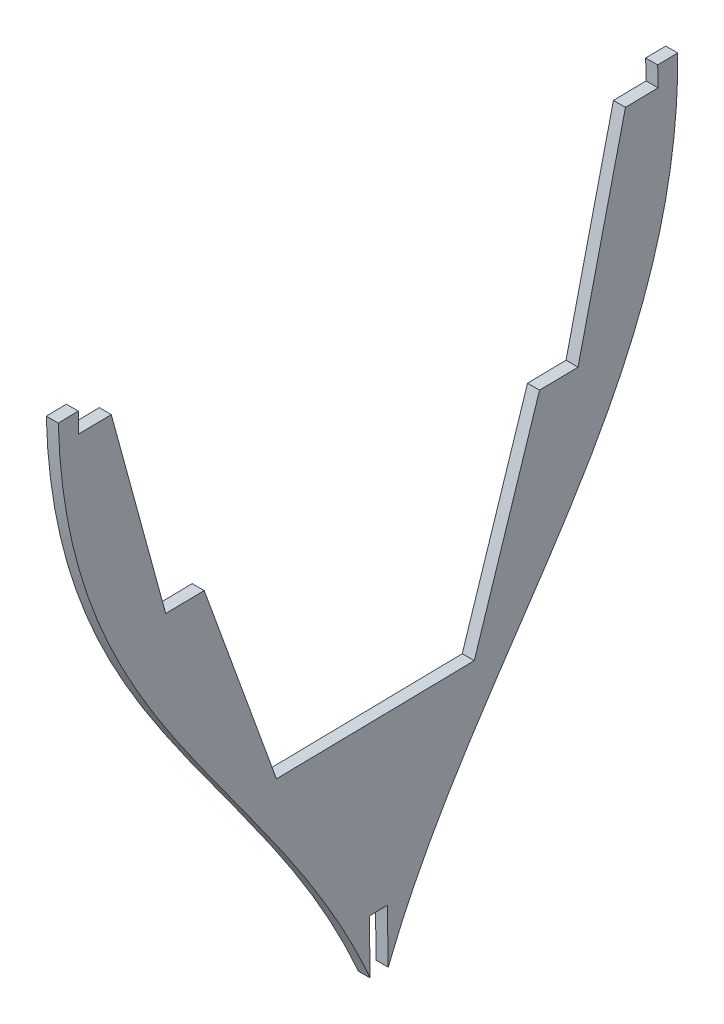
ISO-10303-21;
HEADER;
FILE_DESCRIPTION(('STEP AP214'),'2;1');
FILE_NAME('part.step','',(''),(''),'','','');
FILE_SCHEMA(('AUTOMOTIVE_DESIGN { 1 0 10303 214 1 1 1 1 }'));
ENDSEC;
DATA;
#1=APPLICATION_CONTEXT('core data for automotive mechanical design processes');
#2=APPLICATION_PROTOCOL_DEFINITION('international standard','automotive_design',2000,#1);
#3=PRODUCT_CONTEXT('',#1,'mechanical');
#4=PRODUCT('Part','Part','',(#3));
#5=PRODUCT_RELATED_PRODUCT_CATEGORY('part','',(#4));
#6=PRODUCT_DEFINITION_FORMATION('','',#4);
#7=PRODUCT_DEFINITION_CONTEXT('part definition',#1,'design');
#8=PRODUCT_DEFINITION('design','',#6,#7);
#9=PRODUCT_DEFINITION_SHAPE('','',#8);
#10=(LENGTH_UNIT() NAMED_UNIT(*) SI_UNIT(.MILLI.,.METRE.));
#11=(NAMED_UNIT(*) PLANE_ANGLE_UNIT() SI_UNIT($,.RADIAN.));
#12=(NAMED_UNIT(*) SI_UNIT($,.STERADIAN.) SOLID_ANGLE_UNIT());
#13=UNCERTAINTY_MEASURE_WITH_UNIT(LENGTH_MEASURE(1.E-05),#10,'distance_accuracy_value','');
#14=(GEOMETRIC_REPRESENTATION_CONTEXT(3) GLOBAL_UNCERTAINTY_ASSIGNED_CONTEXT((#13)) GLOBAL_UNIT_ASSIGNED_CONTEXT((#10,
#11,#12)) REPRESENTATION_CONTEXT('',''));
#15=CARTESIAN_POINT('',(0.,0.,0.));
#16=DIRECTION('',(0.,0.,1.));
#17=DIRECTION('',(1.,0.,0.));
#18=AXIS2_PLACEMENT_3D('',#15,#16,#17);
#19=CARTESIAN_POINT('',(6.,27.8968477923104,0.487215218235038));
#20=CARTESIAN_POINT('',(6.,151.528747598314,-43.0475698801011));
#21=CARTESIAN_POINT('',(6.,215.653732265127,-149.467757199494));
#22=CARTESIAN_POINT('',(6.,362.223341232235,-148.243380773087));
#23=B_SPLINE_CURVE_WITH_KNOTS('',3,(#19,#20,#21,#22),.UNSPECIFIED.,.F.,.F.,(4,4),(0.,1.),.UNSPECIFIED.);
#24=DIRECTION('',(-1.,0.,0.));
#25=VECTOR('',#24,1.);
#26=SURFACE_OF_LINEAR_EXTRUSION('',#23,#25);
#27=CARTESIAN_POINT('',(6.,39.416480969907,-3.8122819690517));
#28=VERTEX_POINT('',#27);
#29=CARTESIAN_POINT('',(6.,362.223341232235,-148.243380773087));
#30=VERTEX_POINT('',#29);
#31=EDGE_CURVE('E116',#28,#30,#23,.T.);
#32=ORIENTED_EDGE('',*,*,#31,.F.);
#33=DIRECTION('',(1.,0.,0.));
#34=VECTOR('',#33,1.);
#35=CARTESIAN_POINT('',(0.,39.416480969907,-3.8122819690517));
#36=LINE('',#35,#34);
#37=CARTESIAN_POINT('',(0.,39.416480969907,-3.8122819690517));
#38=VERTEX_POINT('',#37);
#39=EDGE_CURVE('E377',#38,#28,#36,.T.);
#40=ORIENTED_EDGE('',*,*,#39,.F.);
#41=CARTESIAN_POINT('',(0.,27.8968477923104,0.487215218235038));
#42=CARTESIAN_POINT('',(0.,151.528747598314,-43.0475698801011));
#43=CARTESIAN_POINT('',(0.,215.653732265127,-149.467757199494));
#44=CARTESIAN_POINT('',(0.,362.223341232235,-148.243380773087));
#45=B_SPLINE_CURVE_WITH_KNOTS('',3,(#41,#42,#43,#44),.UNSPECIFIED.,.F.,.F.,(4,4),(0.,1.),.UNSPECIFIED.);
#46=CARTESIAN_POINT('',(0.,362.223341232235,-148.243380773087));
#47=VERTEX_POINT('',#46);
#48=EDGE_CURVE('E185',#38,#47,#45,.T.);
#49=ORIENTED_EDGE('',*,*,#48,.T.);
#50=DIRECTION('',(-1.,0.,0.));
#51=VECTOR('',#50,1.);
#52=CARTESIAN_POINT('',(6.,362.223341232235,-148.243380773087));
#53=LINE('',#52,#51);
#54=EDGE_CURVE('E11',#30,#47,#53,.T.);
#55=ORIENTED_EDGE('',*,*,#54,.F.);
#56=EDGE_LOOP('',(#32,#40,#49,#55));
#57=FACE_BOUND('',#56,.T.);
#58=ADVANCED_FACE('F33',(#57),#26,.F.);
#59=CARTESIAN_POINT('',(6.,362.223341232235,-148.243380773087));
#60=DIRECTION('',(0.,-0.999847523789273,-0.0174622212922194));
#61=DIRECTION('',(0.,0.0174622212922194,-0.999847523789274));
#62=AXIS2_PLACEMENT_3D('',#59,#60,#61);
#63=PLANE('',#62);
#64=DIRECTION('',(0.,-0.0174622212922194,0.999847523789273));
#65=VECTOR('',#64,1.);
#66=CARTESIAN_POINT('',(0.,362.223341232235,-148.243380773087));
#67=LINE('',#66,#65);
#68=CARTESIAN_POINT('',(0.,362.048719019313,-138.244905535194));
#69=VERTEX_POINT('',#68);
#70=EDGE_CURVE('E251',#47,#69,#67,.T.);
#71=ORIENTED_EDGE('',*,*,#70,.T.);
#72=DIRECTION('',(-1.,0.,0.));
#73=VECTOR('',#72,1.);
#74=CARTESIAN_POINT('',(6.,362.048719019313,-138.244905535194));
#75=LINE('',#74,#73);
#76=CARTESIAN_POINT('',(6.,362.048719019313,-138.244905535194));
#77=VERTEX_POINT('',#76);
#78=EDGE_CURVE('E41',#77,#69,#75,.T.);
#79=ORIENTED_EDGE('',*,*,#78,.F.);
#80=DIRECTION('',(0.,-0.0174622212922194,0.999847523789273));
#81=VECTOR('',#80,1.);
#82=CARTESIAN_POINT('',(6.,362.223341232235,-148.243380773087));
#83=LINE('',#82,#81);
#84=EDGE_CURVE('E327',#30,#77,#83,.T.);
#85=ORIENTED_EDGE('',*,*,#84,.F.);
#86=ORIENTED_EDGE('',*,*,#54,.T.);
#87=EDGE_LOOP('',(#71,#79,#85,#86));
#88=FACE_BOUND('',#87,.T.);
#89=ADVANCED_FACE('F241',(#88),#63,.F.);
#90=CARTESIAN_POINT('',(6.,362.048719019313,-138.244905535194));
#91=DIRECTION('',(0.,0.0174622212922165,-0.999847523789273));
#92=DIRECTION('',(0.,0.999847523789274,0.0174622212922165));
#93=AXIS2_PLACEMENT_3D('',#90,#91,#92);
#94=PLANE('',#93);
#95=DIRECTION('',(0.,-0.999847523789274,-0.0174622212922165));
#96=VECTOR('',#95,1.);
#97=CARTESIAN_POINT('',(0.,362.048719019313,-138.244905535194));
#98=LINE('',#97,#96);
#99=CARTESIAN_POINT('',(0.,352.05024378142,-138.419527748117));
#100=VERTEX_POINT('',#99);
#101=EDGE_CURVE('E258',#69,#100,#98,.T.);
#102=ORIENTED_EDGE('',*,*,#101,.T.);
#103=DIRECTION('',(-1.,0.,0.));
#104=VECTOR('',#103,1.);
#105=CARTESIAN_POINT('',(6.,352.05024378142,-138.419527748117));
#106=LINE('',#105,#104);
#107=CARTESIAN_POINT('',(6.,352.05024378142,-138.419527748117));
#108=VERTEX_POINT('',#107);
#109=EDGE_CURVE('E262',#108,#100,#106,.T.);
#110=ORIENTED_EDGE('',*,*,#109,.F.);
#111=DIRECTION('',(0.,-0.999847523789274,-0.0174622212922165));
#112=VECTOR('',#111,1.);
#113=CARTESIAN_POINT('',(6.,362.048719019313,-138.244905535194));
#114=LINE('',#113,#112);
#115=EDGE_CURVE('E261',#77,#108,#114,.T.);
#116=ORIENTED_EDGE('',*,*,#115,.F.);
#117=ORIENTED_EDGE('',*,*,#78,.T.);
#118=EDGE_LOOP('',(#102,#110,#116,#117));
#119=FACE_BOUND('',#118,.T.);
#120=ADVANCED_FACE('F238',(#119),#94,.F.);
#121=CARTESIAN_POINT('',(6.,352.05024378142,-138.419527748117));
#122=DIRECTION('',(0.,-0.999847523789273,-0.0174622212922217));
#123=DIRECTION('',(0.,0.0174622212922217,-0.999847523789273));
#124=AXIS2_PLACEMENT_3D('',#121,#122,#123);
#125=PLANE('',#124);
#126=DIRECTION('',(0.,-0.0174622212922217,0.999847523789273));
#127=VECTOR('',#126,1.);
#128=CARTESIAN_POINT('',(0.,352.05024378142,-138.419527748117));
#129=LINE('',#128,#127);
#130=CARTESIAN_POINT('',(0.,351.766257074299,-122.159087500981));
#131=VERTEX_POINT('',#130);
#132=EDGE_CURVE('E265',#100,#131,#129,.T.);
#133=ORIENTED_EDGE('',*,*,#132,.T.);
#134=DIRECTION('',(-1.,0.,0.));
#135=VECTOR('',#134,1.);
#136=CARTESIAN_POINT('',(6.,351.766257074299,-122.159087500981));
#137=LINE('',#136,#135);
#138=CARTESIAN_POINT('',(6.,351.766257074299,-122.159087500981));
#139=VERTEX_POINT('',#138);
#140=EDGE_CURVE('E316',#139,#131,#137,.T.);
#141=ORIENTED_EDGE('',*,*,#140,.F.);
#142=DIRECTION('',(0.,-0.0174622212922217,0.999847523789273));
#143=VECTOR('',#142,1.);
#144=CARTESIAN_POINT('',(6.,352.05024378142,-138.419527748117));
#145=LINE('',#144,#143);
#146=EDGE_CURVE('E321',#108,#139,#145,.T.);
#147=ORIENTED_EDGE('',*,*,#146,.F.);
#148=ORIENTED_EDGE('',*,*,#109,.T.);
#149=EDGE_LOOP('',(#133,#141,#147,#148));
#150=FACE_BOUND('',#149,.T.);
#151=ADVANCED_FACE('F234',(#150),#125,.F.);
#152=CARTESIAN_POINT('',(6.,351.766257074299,-122.159087500981));
#153=DIRECTION('',(0.,-0.229351512790053,-0.973343661602064));
#154=DIRECTION('',(0.,0.973343661602065,-0.229351512790053));
#155=AXIS2_PLACEMENT_3D('',#152,#153,#154);
#156=PLANE('',#155);
#157=DIRECTION('',(0.,-0.973343661602065,0.229351512790053));
#158=VECTOR('',#157,1.);
#159=CARTESIAN_POINT('',(0.,351.766257074299,-122.159087500981));
#160=LINE('',#159,#158);
#161=CARTESIAN_POINT('',(0.,251.337713909767,-98.4948472015425));
#162=VERTEX_POINT('',#161);
#163=EDGE_CURVE('E267',#131,#162,#160,.T.);
#164=ORIENTED_EDGE('',*,*,#163,.T.);
#165=DIRECTION('',(-1.,0.,0.));
#166=VECTOR('',#165,1.);
#167=CARTESIAN_POINT('',(6.,251.337713909767,-98.4948472015425));
#168=LINE('',#167,#166);
#169=CARTESIAN_POINT('',(6.,251.337713909767,-98.4948472015425));
#170=VERTEX_POINT('',#169);
#171=EDGE_CURVE('E313',#170,#162,#168,.T.);
#172=ORIENTED_EDGE('',*,*,#171,.F.);
#173=DIRECTION('',(0.,-0.973343661602065,0.229351512790053));
#174=VECTOR('',#173,1.);
#175=CARTESIAN_POINT('',(6.,351.766257074299,-122.159087500981));
#176=LINE('',#175,#174);
#177=EDGE_CURVE('E323',#139,#170,#176,.T.);
#178=ORIENTED_EDGE('',*,*,#177,.F.);
#179=ORIENTED_EDGE('',*,*,#140,.T.);
#180=EDGE_LOOP('',(#164,#172,#178,#179));
#181=FACE_BOUND('',#180,.T.);
#182=ADVANCED_FACE('F230',(#181),#156,.F.);
#183=CARTESIAN_POINT('',(6.,251.337713909767,-98.4948472015425));
#184=DIRECTION('',(0.,-0.999847523789273,-0.0174622212922211));
#185=DIRECTION('',(0.,0.0174622212922211,-0.999847523789273));
#186=AXIS2_PLACEMENT_3D('',#183,#184,#185);
#187=PLANE('',#186);
#188=DIRECTION('',(0.,-0.0174622212922211,0.999847523789273));
#189=VECTOR('',#188,1.);
#190=CARTESIAN_POINT('',(0.,251.337713909767,-98.4948472015425));
#191=LINE('',#190,#189);
#192=CARTESIAN_POINT('',(0.,251.002379323885,-79.2943428828873));
#193=VERTEX_POINT('',#192);
#194=EDGE_CURVE('E271',#162,#193,#191,.T.);
#195=ORIENTED_EDGE('',*,*,#194,.T.);
#196=DIRECTION('',(-1.,0.,0.));
#197=VECTOR('',#196,1.);
#198=CARTESIAN_POINT('',(6.,251.002379323885,-79.2943428828873));
#199=LINE('',#198,#197);
#200=CARTESIAN_POINT('',(6.,251.002379323885,-79.2943428828873));
#201=VERTEX_POINT('',#200);
#202=EDGE_CURVE('E310',#201,#193,#199,.T.);
#203=ORIENTED_EDGE('',*,*,#202,.F.);
#204=DIRECTION('',(0.,-0.0174622212922211,0.999847523789273));
#205=VECTOR('',#204,1.);
#206=CARTESIAN_POINT('',(6.,251.337713909767,-98.4948472015425));
#207=LINE('',#206,#205);
#208=EDGE_CURVE('E325',#170,#201,#207,.T.);
#209=ORIENTED_EDGE('',*,*,#208,.F.);
#210=ORIENTED_EDGE('',*,*,#171,.T.);
#211=EDGE_LOOP('',(#195,#203,#209,#210));
#212=FACE_BOUND('',#211,.T.);
#213=ADVANCED_FACE('F226',(#212),#187,.F.);
#214=CARTESIAN_POINT('',(6.,251.002379323885,-79.2943428828873));
#215=DIRECTION('',(0.,-0.308006886330143,-0.951384127454947));
#216=DIRECTION('',(0.,0.951384127454947,-0.308006886330143));
#217=AXIS2_PLACEMENT_3D('',#214,#215,#216);
#218=PLANE('',#217);
#219=DIRECTION('',(0.,-0.951384127454947,0.308006886330143));
#220=VECTOR('',#219,1.);
#221=CARTESIAN_POINT('',(0.,251.002379323885,-79.2943428828873));
#222=LINE('',#221,#220);
#223=CARTESIAN_POINT('',(0.,150.41840870766,-46.730676210097));
#224=VERTEX_POINT('',#223);
#225=EDGE_CURVE('E273',#193,#224,#222,.T.);
#226=ORIENTED_EDGE('',*,*,#225,.T.);
#227=DIRECTION('',(-1.,0.,0.));
#228=VECTOR('',#227,1.);
#229=CARTESIAN_POINT('',(6.,150.41840870766,-46.730676210097));
#230=LINE('',#229,#228);
#231=CARTESIAN_POINT('',(6.,150.41840870766,-46.730676210097));
#232=VERTEX_POINT('',#231);
#233=EDGE_CURVE('E307',#232,#224,#230,.T.);
#234=ORIENTED_EDGE('',*,*,#233,.F.);
#235=DIRECTION('',(0.,-0.951384127454947,0.308006886330143));
#236=VECTOR('',#235,1.);
#237=CARTESIAN_POINT('',(6.,251.002379323885,-79.2943428828873));
#238=LINE('',#237,#236);
#239=EDGE_CURVE('E332',#201,#232,#238,.T.);
#240=ORIENTED_EDGE('',*,*,#239,.F.);
#241=ORIENTED_EDGE('',*,*,#202,.T.);
#242=EDGE_LOOP('',(#226,#234,#240,#241));
#243=FACE_BOUND('',#242,.T.);
#244=ADVANCED_FACE('F222',(#243),#218,.F.);
#245=CARTESIAN_POINT('',(6.,150.41840870766,-46.730676210097));
#246=DIRECTION('',(0.,-0.999847523789273,-0.017462221292222));
#247=DIRECTION('',(0.,0.017462221292222,-0.999847523789273));
#248=AXIS2_PLACEMENT_3D('',#245,#246,#247);
#249=PLANE('',#248);
#250=DIRECTION('',(0.,-0.017462221292222,0.999847523789273));
#251=VECTOR('',#250,1.);
#252=CARTESIAN_POINT('',(0.,150.41840870766,-46.730676210097));
#253=LINE('',#252,#251);
#254=CARTESIAN_POINT('',(0.,148.694880815353,51.9546551957129));
#255=VERTEX_POINT('',#254);
#256=EDGE_CURVE('E275',#224,#255,#253,.T.);
#257=ORIENTED_EDGE('',*,*,#256,.T.);
#258=DIRECTION('',(-1.,0.,0.));
#259=VECTOR('',#258,1.);
#260=CARTESIAN_POINT('',(6.,148.694880815353,51.9546551957129));
#261=LINE('',#260,#259);
#262=CARTESIAN_POINT('',(6.,148.694880815353,51.9546551957129));
#263=VERTEX_POINT('',#262);
#264=EDGE_CURVE('E304',#263,#255,#261,.T.);
#265=ORIENTED_EDGE('',*,*,#264,.F.);
#266=DIRECTION('',(0.,-0.017462221292222,0.999847523789273));
#267=VECTOR('',#266,1.);
#268=CARTESIAN_POINT('',(6.,150.41840870766,-46.730676210097));
#269=LINE('',#268,#267);
#270=EDGE_CURVE('E334',#232,#263,#269,.T.);
#271=ORIENTED_EDGE('',*,*,#270,.F.);
#272=ORIENTED_EDGE('',*,*,#233,.T.);
#273=EDGE_LOOP('',(#257,#265,#271,#272));
#274=FACE_BOUND('',#273,.T.);
#275=ADVANCED_FACE('F218',(#274),#249,.F.);
#276=CARTESIAN_POINT('',(6.,248.080414956982,88.0107661269475));
#277=DIRECTION('',(0.,-0.341040539835259,0.940048589270191));
#278=DIRECTION('',(0.,-0.940048589270191,-0.341040539835259));
#279=AXIS2_PLACEMENT_3D('',#276,#277,#278);
#280=PLANE('',#279);
#281=DIRECTION('',(0.,0.940048589270191,0.341040539835259));
#282=VECTOR('',#281,1.);
#283=CARTESIAN_POINT('',(0.,248.080414956982,88.0107661269475));
#284=LINE('',#283,#282);
#285=CARTESIAN_POINT('',(0.,248.080414956982,88.0107661269475));
#286=VERTEX_POINT('',#285);
#287=EDGE_CURVE('E277',#255,#286,#284,.T.);
#288=ORIENTED_EDGE('',*,*,#287,.T.);
#289=DIRECTION('',(-1.,0.,0.));
#290=VECTOR('',#289,1.);
#291=CARTESIAN_POINT('',(6.,248.080414956982,88.0107661269475));
#292=LINE('',#291,#290);
#293=CARTESIAN_POINT('',(6.,248.080414956982,88.0107661269475));
#294=VERTEX_POINT('',#293);
#295=EDGE_CURVE('E301',#294,#286,#292,.T.);
#296=ORIENTED_EDGE('',*,*,#295,.F.);
#297=DIRECTION('',(0.,0.940048589270191,0.341040539835259));
#298=VECTOR('',#297,1.);
#299=CARTESIAN_POINT('',(6.,248.080414956982,88.0107661269475));
#300=LINE('',#299,#298);
#301=EDGE_CURVE('E336',#263,#294,#300,.T.);
#302=ORIENTED_EDGE('',*,*,#301,.F.);
#303=ORIENTED_EDGE('',*,*,#264,.T.);
#304=EDGE_LOOP('',(#288,#296,#302,#303));
#305=FACE_BOUND('',#304,.T.);
#306=ADVANCED_FACE('F214',(#305),#280,.F.);
#307=CARTESIAN_POINT('',(6.,247.7450803711,107.211270445603));
#308=DIRECTION('',(0.,-0.999847523789273,-0.0174622212922211));
#309=DIRECTION('',(0.,0.0174622212922211,-0.999847523789273));
#310=AXIS2_PLACEMENT_3D('',#307,#308,#309);
#311=PLANE('',#310);
#312=DIRECTION('',(0.,-0.0174622212922211,0.999847523789273));
#313=VECTOR('',#312,1.);
#314=CARTESIAN_POINT('',(0.,247.7450803711,107.211270445603));
#315=LINE('',#314,#313);
#316=CARTESIAN_POINT('',(0.,247.7450803711,107.211270445603));
#317=VERTEX_POINT('',#316);
#318=EDGE_CURVE('E279',#286,#317,#315,.T.);
#319=ORIENTED_EDGE('',*,*,#318,.T.);
#320=DIRECTION('',(-1.,0.,0.));
#321=VECTOR('',#320,1.);
#322=CARTESIAN_POINT('',(6.,247.7450803711,107.211270445603));
#323=LINE('',#322,#321);
#324=CARTESIAN_POINT('',(6.,247.7450803711,107.211270445603));
#325=VERTEX_POINT('',#324);
#326=EDGE_CURVE('E298',#325,#317,#323,.T.);
#327=ORIENTED_EDGE('',*,*,#326,.F.);
#328=DIRECTION('',(0.,-0.0174622212922211,0.999847523789273));
#329=VECTOR('',#328,1.);
#330=CARTESIAN_POINT('',(6.,247.7450803711,107.211270445603));
#331=LINE('',#330,#329);
#332=EDGE_CURVE('E338',#294,#325,#331,.T.);
#333=ORIENTED_EDGE('',*,*,#332,.F.);
#334=ORIENTED_EDGE('',*,*,#295,.T.);
#335=EDGE_LOOP('',(#319,#327,#333,#334));
#336=FACE_BOUND('',#335,.T.);
#337=ADVANCED_FACE('F210',(#336),#311,.F.);
#338=CARTESIAN_POINT('',(6.,347.286041964423,134.367955003485));
#339=DIRECTION('',(0.,-0.263199942482856,0.964741307437917));
#340=DIRECTION('',(0.,-0.964741307437917,-0.263199942482856));
#341=AXIS2_PLACEMENT_3D('',#338,#339,#340);
#342=PLANE('',#341);
#343=DIRECTION('',(0.,0.964741307437917,0.263199942482856));
#344=VECTOR('',#343,1.);
#345=CARTESIAN_POINT('',(0.,347.286041964423,134.367955003485));
#346=LINE('',#345,#344);
#347=CARTESIAN_POINT('',(0.,347.286041964423,134.367955003485));
#348=VERTEX_POINT('',#347);
#349=EDGE_CURVE('E281',#317,#348,#346,.T.);
#350=ORIENTED_EDGE('',*,*,#349,.T.);
#351=DIRECTION('',(-1.,0.,0.));
#352=VECTOR('',#351,1.);
#353=CARTESIAN_POINT('',(6.,347.286041964423,134.367955003485));
#354=LINE('',#353,#352);
#355=CARTESIAN_POINT('',(6.,347.286041964423,134.367955003485));
#356=VERTEX_POINT('',#355);
#357=EDGE_CURVE('E171',#356,#348,#354,.T.);
#358=ORIENTED_EDGE('',*,*,#357,.F.);
#359=DIRECTION('',(0.,0.964741307437917,0.263199942482856));
#360=VECTOR('',#359,1.);
#361=CARTESIAN_POINT('',(6.,347.286041964423,134.367955003485));
#362=LINE('',#361,#360);
#363=EDGE_CURVE('E159',#325,#356,#362,.T.);
#364=ORIENTED_EDGE('',*,*,#363,.F.);
#365=ORIENTED_EDGE('',*,*,#326,.T.);
#366=EDGE_LOOP('',(#350,#358,#364,#365));
#367=FACE_BOUND('',#366,.T.);
#368=ADVANCED_FACE('F207',(#367),#342,.F.);
#369=CARTESIAN_POINT('',(6.,347.002055257302,150.628395250621));
#370=DIRECTION('',(0.,-0.999847523789273,-0.0174622212922217));
#371=DIRECTION('',(0.,0.0174622212922217,-0.999847523789273));
#372=AXIS2_PLACEMENT_3D('',#369,#370,#371);
#373=PLANE('',#372);
#374=DIRECTION('',(0.,-0.0174622212922217,0.999847523789273));
#375=VECTOR('',#374,1.);
#376=CARTESIAN_POINT('',(0.,347.002055257302,150.628395250621));
#377=LINE('',#376,#375);
#378=CARTESIAN_POINT('',(0.,347.002055257302,150.628395250621));
#379=VERTEX_POINT('',#378);
#380=EDGE_CURVE('E168',#348,#379,#377,.T.);
#381=ORIENTED_EDGE('',*,*,#380,.T.);
#382=DIRECTION('',(-1.,0.,0.));
#383=VECTOR('',#382,1.);
#384=CARTESIAN_POINT('',(6.,347.002055257302,150.628395250621));
#385=LINE('',#384,#383);
#386=CARTESIAN_POINT('',(6.,347.002055257302,150.628395250621));
#387=VERTEX_POINT('',#386);
#388=EDGE_CURVE('E165',#387,#379,#385,.T.);
#389=ORIENTED_EDGE('',*,*,#388,.F.);
#390=DIRECTION('',(0.,-0.0174622212922217,0.999847523789273));
#391=VECTOR('',#390,1.);
#392=CARTESIAN_POINT('',(6.,347.002055257302,150.628395250621));
#393=LINE('',#392,#391);
#394=EDGE_CURVE('E151',#356,#387,#393,.T.);
#395=ORIENTED_EDGE('',*,*,#394,.F.);
#396=ORIENTED_EDGE('',*,*,#357,.T.);
#397=EDGE_LOOP('',(#381,#389,#395,#396));
#398=FACE_BOUND('',#397,.T.);
#399=ADVANCED_FACE('F166',(#398),#373,.F.);
#400=CARTESIAN_POINT('',(6.,357.000530495195,150.803017463543));
#401=DIRECTION('',(0.,-0.017462221292222,0.999847523789273));
#402=DIRECTION('',(0.,-0.999847523789273,-0.017462221292222));
#403=AXIS2_PLACEMENT_3D('',#400,#401,#402);
#404=PLANE('',#403);
#405=DIRECTION('',(0.,0.999847523789273,0.017462221292222));
#406=VECTOR('',#405,1.);
#407=CARTESIAN_POINT('',(0.,357.000530495195,150.803017463543));
#408=LINE('',#407,#406);
#409=CARTESIAN_POINT('',(0.,357.000530495195,150.803017463543));
#410=VERTEX_POINT('',#409);
#411=EDGE_CURVE('E284',#379,#410,#408,.T.);
#412=ORIENTED_EDGE('',*,*,#411,.T.);
#413=DIRECTION('',(-1.,0.,0.));
#414=VECTOR('',#413,1.);
#415=CARTESIAN_POINT('',(6.,357.000530495195,150.803017463543));
#416=LINE('',#415,#414);
#417=CARTESIAN_POINT('',(6.,357.000530495195,150.803017463543));
#418=VERTEX_POINT('',#417);
#419=EDGE_CURVE('E172',#418,#410,#416,.T.);
#420=ORIENTED_EDGE('',*,*,#419,.F.);
#421=DIRECTION('',(0.,0.999847523789273,0.017462221292222));
#422=VECTOR('',#421,1.);
#423=CARTESIAN_POINT('',(6.,357.000530495195,150.803017463543));
#424=LINE('',#423,#422);
#425=EDGE_CURVE('E156',#387,#418,#424,.T.);
#426=ORIENTED_EDGE('',*,*,#425,.F.);
#427=ORIENTED_EDGE('',*,*,#388,.T.);
#428=EDGE_LOOP('',(#412,#420,#426,#427));
#429=FACE_BOUND('',#428,.T.);
#430=ADVANCED_FACE('F174',(#429),#404,.F.);
#431=CARTESIAN_POINT('',(6.,356.825908282272,160.801492701436));
#432=DIRECTION('',(0.,-0.999847523789273,-0.0174622212922193));
#433=DIRECTION('',(0.,0.0174622212922193,-0.999847523789274));
#434=AXIS2_PLACEMENT_3D('',#431,#432,#433);
#435=PLANE('',#434);
#436=DIRECTION('',(0.,-0.0174622212922193,0.999847523789273));
#437=VECTOR('',#436,1.);
#438=CARTESIAN_POINT('',(0.,356.825908282272,160.801492701436));
#439=LINE('',#438,#437);
#440=CARTESIAN_POINT('',(0.,356.825908282272,160.801492701436));
#441=VERTEX_POINT('',#440);
#442=EDGE_CURVE('E108',#410,#441,#439,.T.);
#443=ORIENTED_EDGE('',*,*,#442,.T.);
#444=DIRECTION('',(-1.,0.,0.));
#445=VECTOR('',#444,1.);
#446=CARTESIAN_POINT('',(6.,356.825908282272,160.801492701436));
#447=LINE('',#446,#445);
#448=CARTESIAN_POINT('',(6.,356.825908282272,160.801492701436));
#449=VERTEX_POINT('',#448);
#450=EDGE_CURVE('E184',#449,#441,#447,.T.);
#451=ORIENTED_EDGE('',*,*,#450,.F.);
#452=DIRECTION('',(0.,-0.0174622212922193,0.999847523789273));
#453=VECTOR('',#452,1.);
#454=CARTESIAN_POINT('',(6.,356.825908282272,160.801492701436));
#455=LINE('',#454,#453);
#456=EDGE_CURVE('E57',#418,#449,#455,.T.);
#457=ORIENTED_EDGE('',*,*,#456,.F.);
#458=ORIENTED_EDGE('',*,*,#419,.T.);
#459=EDGE_LOOP('',(#443,#451,#457,#458));
#460=FACE_BOUND('',#459,.T.);
#461=ADVANCED_FACE('F197',(#460),#435,.F.);
#462=CARTESIAN_POINT('',(6.,356.825908282272,160.801492701436));
#463=CARTESIAN_POINT('',(6.,210.302931870083,156.907041043331));
#464=CARTESIAN_POINT('',(6.,149.933153379042,48.3125670929661));
#465=CARTESIAN_POINT('',(6.,27.8968477923104,0.487215218235038));
#466=B_SPLINE_CURVE_WITH_KNOTS('',3,(#462,#463,#464,#465),.UNSPECIFIED.,.F.,.F.,(4,4),(0.,1.),.UNSPECIFIED.);
#467=DIRECTION('',(-1.,0.,0.));
#468=VECTOR('',#467,1.);
#469=SURFACE_OF_LINEAR_EXTRUSION('',#466,#468);
#470=CARTESIAN_POINT('',(0.,356.825908282272,160.801492701436));
#471=CARTESIAN_POINT('',(0.,210.302931870083,156.907041043331));
#472=CARTESIAN_POINT('',(0.,149.933153379042,48.3125670929661));
#473=CARTESIAN_POINT('',(0.,27.8968477923104,0.487215218235038));
#474=B_SPLINE_CURVE_WITH_KNOTS('',3,(#470,#471,#472,#473),.UNSPECIFIED.,.F.,.F.,(4,4),(0.,1.),.UNSPECIFIED.);
#475=CARTESIAN_POINT('',(0.,39.259320978277,5.18634574505176));
#476=VERTEX_POINT('',#475);
#477=EDGE_CURVE('E287',#441,#476,#474,.T.);
#478=ORIENTED_EDGE('',*,*,#477,.T.);
#479=DIRECTION('',(1.,0.,0.));
#480=VECTOR('',#479,1.);
#481=CARTESIAN_POINT('',(0.,39.259320978277,5.18634574505176));
#482=LINE('',#481,#480);
#483=CARTESIAN_POINT('',(6.,39.259320978277,5.18634574505176));
#484=VERTEX_POINT('',#483);
#485=EDGE_CURVE('E349',#476,#484,#482,.T.);
#486=ORIENTED_EDGE('',*,*,#485,.T.);
#487=EDGE_CURVE('E176',#449,#484,#466,.T.);
#488=ORIENTED_EDGE('',*,*,#487,.F.);
#489=ORIENTED_EDGE('',*,*,#450,.T.);
#490=EDGE_LOOP('',(#478,#486,#488,#489));
#491=FACE_BOUND('',#490,.T.);
#492=ADVANCED_FACE('F193',(#491),#469,.F.);
#493=CARTESIAN_POINT('',(6.,186.458453576859,-90.6627683492046));
#494=DIRECTION('',(1.,0.,0.));
#495=DIRECTION('',(0.,0.,-1.));
#496=AXIS2_PLACEMENT_3D('',#493,#494,#495);
#497=PLANE('',#496);
#498=DIRECTION('',(0.,-0.999847523789273,-0.0174622212922221));
#499=VECTOR('',#498,1.);
#500=CARTESIAN_POINT('',(6.,39.259320978277,5.18634574505176));
#501=LINE('',#500,#499);
#502=CARTESIAN_POINT('',(6.,66.2552041205874,5.65782571994176));
#503=VERTEX_POINT('',#502);
#504=EDGE_CURVE('E353',#503,#484,#501,.T.);
#505=ORIENTED_EDGE('',*,*,#504,.F.);
#506=DIRECTION('',(0.,-0.0174622212922227,0.999847523789273));
#507=VECTOR('',#506,1.);
#508=CARTESIAN_POINT('',(6.,66.2552041205874,5.65782571994176));
#509=LINE('',#508,#507);
#510=CARTESIAN_POINT('',(6.,66.4123641122174,-3.3408019941617));
#511=VERTEX_POINT('',#510);
#512=EDGE_CURVE('E371',#511,#503,#509,.T.);
#513=ORIENTED_EDGE('',*,*,#512,.F.);
#514=DIRECTION('',(0.,0.999847523789273,0.0174622212922223));
#515=VECTOR('',#514,1.);
#516=CARTESIAN_POINT('',(6.,66.4123641122174,-3.3408019941617));
#517=LINE('',#516,#515);
#518=EDGE_CURVE('E384',#28,#511,#517,.T.);
#519=ORIENTED_EDGE('',*,*,#518,.F.);
#520=ORIENTED_EDGE('',*,*,#31,.T.);
#521=ORIENTED_EDGE('',*,*,#84,.T.);
#522=ORIENTED_EDGE('',*,*,#115,.T.);
#523=ORIENTED_EDGE('',*,*,#146,.T.);
#524=ORIENTED_EDGE('',*,*,#177,.T.);
#525=ORIENTED_EDGE('',*,*,#208,.T.);
#526=ORIENTED_EDGE('',*,*,#239,.T.);
#527=ORIENTED_EDGE('',*,*,#270,.T.);
#528=ORIENTED_EDGE('',*,*,#301,.T.);
#529=ORIENTED_EDGE('',*,*,#332,.T.);
#530=ORIENTED_EDGE('',*,*,#363,.T.);
#531=ORIENTED_EDGE('',*,*,#394,.T.);
#532=ORIENTED_EDGE('',*,*,#425,.T.);
#533=ORIENTED_EDGE('',*,*,#456,.T.);
#534=ORIENTED_EDGE('',*,*,#487,.T.);
#535=EDGE_LOOP('',(#505,#513,#519,#520,#521,#522,#523,#524,#525,#526,#527,#528,#529,#530,#531,
#532,#533,#534));
#536=FACE_BOUND('',#535,.T.);
#537=ADVANCED_FACE('F154',(#536),#497,.T.);
#538=CARTESIAN_POINT('',(0.,186.458453576859,-90.6627683492046));
#539=DIRECTION('',(1.,0.,0.));
#540=DIRECTION('',(0.,0.,-1.));
#541=AXIS2_PLACEMENT_3D('',#538,#539,#540);
#542=PLANE('',#541);
#543=DIRECTION('',(0.,-0.0174622212922227,0.999847523789273));
#544=VECTOR('',#543,1.);
#545=CARTESIAN_POINT('',(0.,66.2552041205874,5.65782571994176));
#546=LINE('',#545,#544);
#547=CARTESIAN_POINT('',(0.,66.4123641122174,-3.34080199416171));
#548=VERTEX_POINT('',#547);
#549=CARTESIAN_POINT('',(0.,66.2552041205874,5.65782571994176));
#550=VERTEX_POINT('',#549);
#551=EDGE_CURVE('E48',#548,#550,#546,.T.);
#552=ORIENTED_EDGE('',*,*,#551,.T.);
#553=DIRECTION('',(0.,-0.999847523789273,-0.0174622212922221));
#554=VECTOR('',#553,1.);
#555=CARTESIAN_POINT('',(0.,39.259320978277,5.18634574505176));
#556=LINE('',#555,#554);
#557=EDGE_CURVE('E375',#550,#476,#556,.T.);
#558=ORIENTED_EDGE('',*,*,#557,.T.);
#559=ORIENTED_EDGE('',*,*,#477,.F.);
#560=ORIENTED_EDGE('',*,*,#442,.F.);
#561=ORIENTED_EDGE('',*,*,#411,.F.);
#562=ORIENTED_EDGE('',*,*,#380,.F.);
#563=ORIENTED_EDGE('',*,*,#349,.F.);
#564=ORIENTED_EDGE('',*,*,#318,.F.);
#565=ORIENTED_EDGE('',*,*,#287,.F.);
#566=ORIENTED_EDGE('',*,*,#256,.F.);
#567=ORIENTED_EDGE('',*,*,#225,.F.);
#568=ORIENTED_EDGE('',*,*,#194,.F.);
#569=ORIENTED_EDGE('',*,*,#163,.F.);
#570=ORIENTED_EDGE('',*,*,#132,.F.);
#571=ORIENTED_EDGE('',*,*,#101,.F.);
#572=ORIENTED_EDGE('',*,*,#70,.F.);
#573=ORIENTED_EDGE('',*,*,#48,.F.);
#574=DIRECTION('',(0.,0.999847523789273,0.0174622212922223));
#575=VECTOR('',#574,1.);
#576=CARTESIAN_POINT('',(0.,66.4123641122174,-3.3408019941617));
#577=LINE('',#576,#575);
#578=EDGE_CURVE('E380',#38,#548,#577,.T.);
#579=ORIENTED_EDGE('',*,*,#578,.T.);
#580=EDGE_LOOP('',(#552,#558,#559,#560,#561,#562,#563,#564,#565,#566,#567,#568,#569,#570,#571,
#572,#573,#579));
#581=FACE_BOUND('',#580,.T.);
#582=ADVANCED_FACE('F199',(#581),#542,.F.);
#583=CARTESIAN_POINT('',(0.,39.259320978277,5.18634574505176));
#584=DIRECTION('',(0.,-0.0174622212922221,0.999847523789273));
#585=DIRECTION('',(0.,-0.999847523789273,-0.0174622212922221));
#586=AXIS2_PLACEMENT_3D('',#583,#584,#585);
#587=PLANE('',#586);
#588=ORIENTED_EDGE('',*,*,#504,.T.);
#589=ORIENTED_EDGE('',*,*,#485,.F.);
#590=ORIENTED_EDGE('',*,*,#557,.F.);
#591=DIRECTION('',(1.,0.,0.));
#592=VECTOR('',#591,1.);
#593=CARTESIAN_POINT('',(0.,66.2552041205874,5.65782571994176));
#594=LINE('',#593,#592);
#595=EDGE_CURVE('E362',#550,#503,#594,.T.);
#596=ORIENTED_EDGE('',*,*,#595,.T.);
#597=EDGE_LOOP('',(#588,#589,#590,#596));
#598=FACE_BOUND('',#597,.T.);
#599=ADVANCED_FACE('F376',(#598),#587,.F.);
#600=CARTESIAN_POINT('',(0.,66.2552041205874,5.65782571994176));
#601=DIRECTION('',(0.,0.999847523789273,0.0174622212922227));
#602=DIRECTION('',(0.,-0.0174622212922227,0.999847523789273));
#603=AXIS2_PLACEMENT_3D('',#600,#601,#602);
#604=PLANE('',#603);
#605=ORIENTED_EDGE('',*,*,#512,.T.);
#606=ORIENTED_EDGE('',*,*,#595,.F.);
#607=ORIENTED_EDGE('',*,*,#551,.F.);
#608=DIRECTION('',(1.,0.,0.));
#609=VECTOR('',#608,1.);
#610=CARTESIAN_POINT('',(0.,66.4123641122174,-3.3408019941617));
#611=LINE('',#610,#609);
#612=EDGE_CURVE('E372',#548,#511,#611,.T.);
#613=ORIENTED_EDGE('',*,*,#612,.T.);
#614=EDGE_LOOP('',(#605,#606,#607,#613));
#615=FACE_BOUND('',#614,.T.);
#616=ADVANCED_FACE('F370',(#615),#604,.F.);
#617=CARTESIAN_POINT('',(0.,66.4123641122174,-3.3408019941617));
#618=DIRECTION('',(0.,0.0174622212922223,-0.999847523789273));
#619=DIRECTION('',(0.,0.999847523789273,0.0174622212922223));
#620=AXIS2_PLACEMENT_3D('',#617,#618,#619);
#621=PLANE('',#620);
#622=ORIENTED_EDGE('',*,*,#518,.T.);
#623=ORIENTED_EDGE('',*,*,#612,.F.);
#624=ORIENTED_EDGE('',*,*,#578,.F.);
#625=ORIENTED_EDGE('',*,*,#39,.T.);
#626=EDGE_LOOP('',(#622,#623,#624,#625));
#627=FACE_BOUND('',#626,.T.);
#628=ADVANCED_FACE('F399',(#627),#621,.F.);
#629=CLOSED_SHELL('',(#58,#89,#120,#151,#182,#213,#244,#275,#306,#337,#368,#399,#430,#461,#492,
#537,#582,#599,#616,#628));
#630=MANIFOLD_SOLID_BREP('B2',#629);
#631=ADVANCED_BREP_SHAPE_REPRESENTATION('',(#18,#630),#14);
#632=SHAPE_DEFINITION_REPRESENTATION(#9,#631);
ENDSEC;
END-ISO-10303-21;
